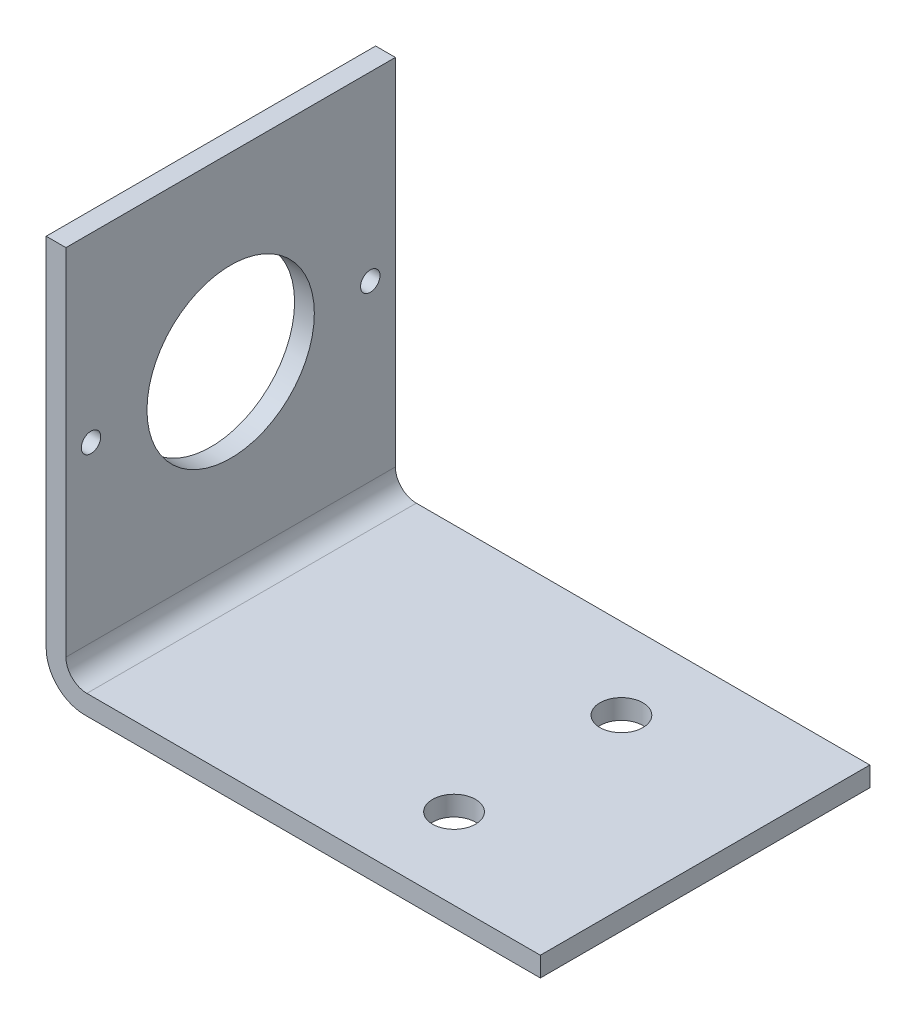
ISO-10303-21;
HEADER;
FILE_DESCRIPTION(('STEP AP214'),'2;1');
FILE_NAME('part.step','',(''),(''),'','','');
FILE_SCHEMA(('AUTOMOTIVE_DESIGN { 1 0 10303 214 1 1 1 1 }'));
ENDSEC;
DATA;
#1=APPLICATION_CONTEXT('core data for automotive mechanical design processes');
#2=APPLICATION_PROTOCOL_DEFINITION('international standard','automotive_design',2000,#1);
#3=PRODUCT_CONTEXT('',#1,'mechanical');
#4=PRODUCT('Part','Part','',(#3));
#5=PRODUCT_RELATED_PRODUCT_CATEGORY('part','',(#4));
#6=PRODUCT_DEFINITION_FORMATION('','',#4);
#7=PRODUCT_DEFINITION_CONTEXT('part definition',#1,'design');
#8=PRODUCT_DEFINITION('design','',#6,#7);
#9=PRODUCT_DEFINITION_SHAPE('','',#8);
#10=(LENGTH_UNIT() NAMED_UNIT(*) SI_UNIT(.MILLI.,.METRE.));
#11=(NAMED_UNIT(*) PLANE_ANGLE_UNIT() SI_UNIT($,.RADIAN.));
#12=(NAMED_UNIT(*) SI_UNIT($,.STERADIAN.) SOLID_ANGLE_UNIT());
#13=UNCERTAINTY_MEASURE_WITH_UNIT(LENGTH_MEASURE(1.E-05),#10,'distance_accuracy_value','');
#14=(GEOMETRIC_REPRESENTATION_CONTEXT(3) GLOBAL_UNCERTAINTY_ASSIGNED_CONTEXT((#13)) GLOBAL_UNIT_ASSIGNED_CONTEXT((#10,
#11,#12)) REPRESENTATION_CONTEXT('',''));
#15=CARTESIAN_POINT('',(0.,0.,0.));
#16=DIRECTION('',(0.,0.,1.));
#17=DIRECTION('',(1.,0.,0.));
#18=AXIS2_PLACEMENT_3D('',#15,#16,#17);
#19=CARTESIAN_POINT('',(0.,59.9948,50.));
#20=DIRECTION('',(0.,-1.,0.));
#21=DIRECTION('',(0.,0.,-1.));
#22=AXIS2_PLACEMENT_3D('',#19,#20,#21);
#23=PLANE('',#22);
#24=DIRECTION('',(-1.,0.,0.));
#25=VECTOR('',#24,1.);
#26=CARTESIAN_POINT('',(0.,59.9948,0.));
#27=LINE('',#26,#25);
#28=CARTESIAN_POINT('',(2.9972,59.9948,0.));
#29=VERTEX_POINT('',#28);
#30=CARTESIAN_POINT('',(0.,59.9948,0.));
#31=VERTEX_POINT('',#30);
#32=EDGE_CURVE('E130',#29,#31,#27,.T.);
#33=ORIENTED_EDGE('',*,*,#32,.T.);
#34=DIRECTION('',(0.,0.,-1.));
#35=VECTOR('',#34,1.);
#36=CARTESIAN_POINT('',(0.,59.9948,50.));
#37=LINE('',#36,#35);
#38=CARTESIAN_POINT('',(0.,59.9948,50.));
#39=VERTEX_POINT('',#38);
#40=EDGE_CURVE('E11',#39,#31,#37,.T.);
#41=ORIENTED_EDGE('',*,*,#40,.F.);
#42=DIRECTION('',(-1.,0.,0.));
#43=VECTOR('',#42,1.);
#44=CARTESIAN_POINT('',(0.,59.9948,50.));
#45=LINE('',#44,#43);
#46=CARTESIAN_POINT('',(2.9972,59.9948,50.));
#47=VERTEX_POINT('',#46);
#48=EDGE_CURVE('E145',#47,#39,#45,.T.);
#49=ORIENTED_EDGE('',*,*,#48,.F.);
#50=DIRECTION('',(0.,0.,-1.));
#51=VECTOR('',#50,1.);
#52=CARTESIAN_POINT('',(2.9972,59.9948,50.));
#53=LINE('',#52,#51);
#54=EDGE_CURVE('E126',#47,#29,#53,.T.);
#55=ORIENTED_EDGE('',*,*,#54,.T.);
#56=EDGE_LOOP('',(#33,#41,#49,#55));
#57=FACE_BOUND('',#56,.T.);
#58=ADVANCED_FACE('F32',(#57),#23,.F.);
#59=CARTESIAN_POINT('',(0.,5.84200000000004,50.));
#60=DIRECTION('',(1.,0.,0.));
#61=DIRECTION('',(0.,0.,-1.));
#62=AXIS2_PLACEMENT_3D('',#59,#60,#61);
#63=PLANE('',#62);
#64=CARTESIAN_POINT('',(0.,32.5,46.19));
#65=DIRECTION('',(-1.,0.,0.));
#66=DIRECTION('',(0.,0.,-1.));
#67=AXIS2_PLACEMENT_3D('',#64,#65,#66);
#68=CIRCLE('',#67,1.4732);
#69=CARTESIAN_POINT('',(0.,32.5,44.7168));
#70=VERTEX_POINT('',#69);
#71=EDGE_CURVE('E173',#70,#70,#68,.T.);
#72=ORIENTED_EDGE('',*,*,#71,.F.);
#73=EDGE_LOOP('',(#72));
#74=FACE_BOUND('',#73,.T.);
#75=CARTESIAN_POINT('',(0.,32.5,3.81));
#76=DIRECTION('',(-1.,0.,0.));
#77=DIRECTION('',(0.,0.,1.));
#78=AXIS2_PLACEMENT_3D('',#75,#76,#77);
#79=CIRCLE('',#78,1.4732);
#80=CARTESIAN_POINT('',(0.,32.5,5.2832));
#81=VERTEX_POINT('',#80);
#82=EDGE_CURVE('E163',#81,#81,#79,.T.);
#83=ORIENTED_EDGE('',*,*,#82,.F.);
#84=EDGE_LOOP('',(#83));
#85=FACE_BOUND('',#84,.T.);
#86=CARTESIAN_POINT('',(0.,32.5,25.));
#87=DIRECTION('',(-1.,0.,0.));
#88=DIRECTION('',(0.,0.,1.));
#89=AXIS2_PLACEMENT_3D('',#86,#87,#88);
#90=CIRCLE('',#89,12.7);
#91=CARTESIAN_POINT('',(0.,32.5,37.7));
#92=VERTEX_POINT('',#91);
#93=EDGE_CURVE('E160',#92,#92,#90,.T.);
#94=ORIENTED_EDGE('',*,*,#93,.F.);
#95=EDGE_LOOP('',(#94));
#96=FACE_BOUND('',#95,.T.);
#97=DIRECTION('',(0.,-1.,0.));
#98=VECTOR('',#97,1.);
#99=CARTESIAN_POINT('',(0.,5.84200000000004,0.));
#100=LINE('',#99,#98);
#101=CARTESIAN_POINT('',(0.,5.84200000000004,0.));
#102=VERTEX_POINT('',#101);
#103=EDGE_CURVE('E133',#31,#102,#100,.T.);
#104=ORIENTED_EDGE('',*,*,#103,.T.);
#105=DIRECTION('',(0.,0.,-1.));
#106=VECTOR('',#105,1.);
#107=CARTESIAN_POINT('',(0.,5.84200000000004,50.));
#108=LINE('',#107,#106);
#109=CARTESIAN_POINT('',(0.,5.84200000000004,50.));
#110=VERTEX_POINT('',#109);
#111=EDGE_CURVE('E41',#110,#102,#108,.T.);
#112=ORIENTED_EDGE('',*,*,#111,.F.);
#113=DIRECTION('',(0.,-1.,0.));
#114=VECTOR('',#113,1.);
#115=CARTESIAN_POINT('',(0.,5.84200000000004,50.));
#116=LINE('',#115,#114);
#117=EDGE_CURVE('E93',#39,#110,#116,.T.);
#118=ORIENTED_EDGE('',*,*,#117,.F.);
#119=ORIENTED_EDGE('',*,*,#40,.T.);
#120=EDGE_LOOP('',(#104,#112,#118,#119));
#121=FACE_BOUND('',#120,.T.);
#122=ADVANCED_FACE('F220',(#74,#85,#96,#121),#63,.F.);
#123=CARTESIAN_POINT('',(5.842,5.842,50.));
#124=DIRECTION('',(0.,0.,-1.));
#125=DIRECTION('',(-1.,0.,0.));
#126=AXIS2_PLACEMENT_3D('',#123,#124,#125);
#127=CYLINDRICAL_SURFACE('',#126,5.842);
#128=CARTESIAN_POINT('',(5.842,5.842,0.));
#129=DIRECTION('',(0.,0.,1.));
#130=DIRECTION('',(1.,0.,0.));
#131=AXIS2_PLACEMENT_3D('',#128,#129,#130);
#132=CIRCLE('',#131,5.842);
#133=CARTESIAN_POINT('',(5.84200000000004,0.,0.));
#134=VERTEX_POINT('',#133);
#135=EDGE_CURVE('E136',#102,#134,#132,.T.);
#136=ORIENTED_EDGE('',*,*,#135,.T.);
#137=DIRECTION('',(0.,0.,-1.));
#138=VECTOR('',#137,1.);
#139=CARTESIAN_POINT('',(5.84200000000004,0.,50.));
#140=LINE('',#139,#138);
#141=CARTESIAN_POINT('',(5.84200000000004,0.,50.));
#142=VERTEX_POINT('',#141);
#143=EDGE_CURVE('E152',#142,#134,#140,.T.);
#144=ORIENTED_EDGE('',*,*,#143,.F.);
#145=CARTESIAN_POINT('',(5.842,5.842,50.));
#146=DIRECTION('',(0.,0.,1.));
#147=DIRECTION('',(1.,0.,0.));
#148=AXIS2_PLACEMENT_3D('',#145,#146,#147);
#149=CIRCLE('',#148,5.842);
#150=EDGE_CURVE('E188',#110,#142,#149,.T.);
#151=ORIENTED_EDGE('',*,*,#150,.F.);
#152=ORIENTED_EDGE('',*,*,#111,.T.);
#153=EDGE_LOOP('',(#136,#144,#151,#152));
#154=FACE_BOUND('',#153,.T.);
#155=ADVANCED_FACE('F224',(#154),#127,.T.);
#156=CARTESIAN_POINT('',(5.84200000000004,0.,50.));
#157=DIRECTION('',(0.,1.,0.));
#158=DIRECTION('',(0.,0.,1.));
#159=AXIS2_PLACEMENT_3D('',#156,#157,#158);
#160=PLANE('',#159);
#161=CARTESIAN_POINT('',(49.6,0.,37.7));
#162=DIRECTION('',(0.,1.,0.));
#163=DIRECTION('',(0.,0.,1.));
#164=AXIS2_PLACEMENT_3D('',#161,#162,#163);
#165=CIRCLE('',#164,3.26389999999999);
#166=CARTESIAN_POINT('',(49.6,0.,40.9639));
#167=VERTEX_POINT('',#166);
#168=EDGE_CURVE('E176',#167,#167,#165,.T.);
#169=ORIENTED_EDGE('',*,*,#168,.T.);
#170=EDGE_LOOP('',(#169));
#171=FACE_BOUND('',#170,.T.);
#172=CARTESIAN_POINT('',(49.6,0.,12.3));
#173=DIRECTION('',(0.,1.,0.));
#174=DIRECTION('',(0.,0.,1.));
#175=AXIS2_PLACEMENT_3D('',#172,#173,#174);
#176=CIRCLE('',#175,3.26389999999999);
#177=CARTESIAN_POINT('',(49.6,0.,15.5639));
#178=VERTEX_POINT('',#177);
#179=EDGE_CURVE('E134',#178,#178,#176,.T.);
#180=ORIENTED_EDGE('',*,*,#179,.T.);
#181=EDGE_LOOP('',(#180));
#182=FACE_BOUND('',#181,.T.);
#183=DIRECTION('',(1.,0.,0.));
#184=VECTOR('',#183,1.);
#185=CARTESIAN_POINT('',(5.84200000000004,0.,0.));
#186=LINE('',#185,#184);
#187=CARTESIAN_POINT('',(75.,0.,0.));
#188=VERTEX_POINT('',#187);
#189=EDGE_CURVE('E138',#134,#188,#186,.T.);
#190=ORIENTED_EDGE('',*,*,#189,.T.);
#191=DIRECTION('',(0.,0.,-1.));
#192=VECTOR('',#191,1.);
#193=CARTESIAN_POINT('',(75.,0.,50.));
#194=LINE('',#193,#192);
#195=CARTESIAN_POINT('',(75.,0.,50.));
#196=VERTEX_POINT('',#195);
#197=EDGE_CURVE('E149',#196,#188,#194,.T.);
#198=ORIENTED_EDGE('',*,*,#197,.F.);
#199=DIRECTION('',(1.,0.,0.));
#200=VECTOR('',#199,1.);
#201=CARTESIAN_POINT('',(5.84200000000004,0.,50.));
#202=LINE('',#201,#200);
#203=EDGE_CURVE('E190',#142,#196,#202,.T.);
#204=ORIENTED_EDGE('',*,*,#203,.F.);
#205=ORIENTED_EDGE('',*,*,#143,.T.);
#206=EDGE_LOOP('',(#190,#198,#204,#205));
#207=FACE_BOUND('',#206,.T.);
#208=ADVANCED_FACE('F196',(#171,#182,#207),#160,.F.);
#209=CARTESIAN_POINT('',(75.,2.9972,50.));
#210=DIRECTION('',(-1.,0.,0.));
#211=DIRECTION('',(0.,0.,1.));
#212=AXIS2_PLACEMENT_3D('',#209,#210,#211);
#213=PLANE('',#212);
#214=DIRECTION('',(0.,1.,0.));
#215=VECTOR('',#214,1.);
#216=CARTESIAN_POINT('',(75.,2.9972,0.));
#217=LINE('',#216,#215);
#218=CARTESIAN_POINT('',(75.,2.9972,0.));
#219=VERTEX_POINT('',#218);
#220=EDGE_CURVE('E140',#188,#219,#217,.T.);
#221=ORIENTED_EDGE('',*,*,#220,.T.);
#222=DIRECTION('',(0.,0.,-1.));
#223=VECTOR('',#222,1.);
#224=CARTESIAN_POINT('',(75.,2.9972,50.));
#225=LINE('',#224,#223);
#226=CARTESIAN_POINT('',(75.,2.9972,50.));
#227=VERTEX_POINT('',#226);
#228=EDGE_CURVE('E121',#227,#219,#225,.T.);
#229=ORIENTED_EDGE('',*,*,#228,.F.);
#230=DIRECTION('',(0.,1.,0.));
#231=VECTOR('',#230,1.);
#232=CARTESIAN_POINT('',(75.,2.9972,50.));
#233=LINE('',#232,#231);
#234=EDGE_CURVE('E112',#196,#227,#233,.T.);
#235=ORIENTED_EDGE('',*,*,#234,.F.);
#236=ORIENTED_EDGE('',*,*,#197,.T.);
#237=EDGE_LOOP('',(#221,#229,#235,#236));
#238=FACE_BOUND('',#237,.T.);
#239=ADVANCED_FACE('F200',(#238),#213,.F.);
#240=CARTESIAN_POINT('',(6.1722,2.9972,50.));
#241=DIRECTION('',(0.,-1.,0.));
#242=DIRECTION('',(0.,0.,-1.));
#243=AXIS2_PLACEMENT_3D('',#240,#241,#242);
#244=PLANE('',#243);
#245=CARTESIAN_POINT('',(49.6,2.9972,37.7));
#246=DIRECTION('',(0.,1.,0.));
#247=DIRECTION('',(0.,0.,1.));
#248=AXIS2_PLACEMENT_3D('',#245,#246,#247);
#249=CIRCLE('',#248,3.26389999999999);
#250=CARTESIAN_POINT('',(49.6,2.9972,40.9639));
#251=VERTEX_POINT('',#250);
#252=EDGE_CURVE('E159',#251,#251,#249,.T.);
#253=ORIENTED_EDGE('',*,*,#252,.F.);
#254=EDGE_LOOP('',(#253));
#255=FACE_BOUND('',#254,.T.);
#256=CARTESIAN_POINT('',(49.6,2.9972,12.3));
#257=DIRECTION('',(0.,1.,0.));
#258=DIRECTION('',(0.,0.,1.));
#259=AXIS2_PLACEMENT_3D('',#256,#257,#258);
#260=CIRCLE('',#259,3.26389999999999);
#261=CARTESIAN_POINT('',(49.6,2.9972,15.5639));
#262=VERTEX_POINT('',#261);
#263=EDGE_CURVE('E179',#262,#262,#260,.T.);
#264=ORIENTED_EDGE('',*,*,#263,.F.);
#265=EDGE_LOOP('',(#264));
#266=FACE_BOUND('',#265,.T.);
#267=DIRECTION('',(-1.,0.,0.));
#268=VECTOR('',#267,1.);
#269=CARTESIAN_POINT('',(6.1722,2.9972,0.));
#270=LINE('',#269,#268);
#271=CARTESIAN_POINT('',(6.1722,2.9972,0.));
#272=VERTEX_POINT('',#271);
#273=EDGE_CURVE('E120',#219,#272,#270,.T.);
#274=ORIENTED_EDGE('',*,*,#273,.T.);
#275=DIRECTION('',(0.,0.,-1.));
#276=VECTOR('',#275,1.);
#277=CARTESIAN_POINT('',(6.1722,2.9972,50.));
#278=LINE('',#277,#276);
#279=CARTESIAN_POINT('',(6.1722,2.9972,50.));
#280=VERTEX_POINT('',#279);
#281=EDGE_CURVE('E117',#280,#272,#278,.T.);
#282=ORIENTED_EDGE('',*,*,#281,.F.);
#283=DIRECTION('',(-1.,0.,0.));
#284=VECTOR('',#283,1.);
#285=CARTESIAN_POINT('',(6.1722,2.9972,50.));
#286=LINE('',#285,#284);
#287=EDGE_CURVE('E106',#227,#280,#286,.T.);
#288=ORIENTED_EDGE('',*,*,#287,.F.);
#289=ORIENTED_EDGE('',*,*,#228,.T.);
#290=EDGE_LOOP('',(#274,#282,#288,#289));
#291=FACE_BOUND('',#290,.T.);
#292=ADVANCED_FACE('F118',(#255,#266,#291),#244,.F.);
#293=CARTESIAN_POINT('',(6.1722,6.1722,50.));
#294=DIRECTION('',(0.,0.,-1.));
#295=DIRECTION('',(-1.,0.,0.));
#296=AXIS2_PLACEMENT_3D('',#293,#294,#295);
#297=CYLINDRICAL_SURFACE('',#296,3.175);
#298=CARTESIAN_POINT('',(6.1722,6.1722,0.));
#299=DIRECTION('',(0.,0.,-1.));
#300=DIRECTION('',(-1.,0.,0.));
#301=AXIS2_PLACEMENT_3D('',#298,#299,#300);
#302=CIRCLE('',#301,3.175);
#303=CARTESIAN_POINT('',(2.9972,6.1722,0.));
#304=VERTEX_POINT('',#303);
#305=EDGE_CURVE('E79',#272,#304,#302,.T.);
#306=ORIENTED_EDGE('',*,*,#305,.T.);
#307=DIRECTION('',(0.,0.,-1.));
#308=VECTOR('',#307,1.);
#309=CARTESIAN_POINT('',(2.9972,6.1722,50.));
#310=LINE('',#309,#308);
#311=CARTESIAN_POINT('',(2.9972,6.1722,50.));
#312=VERTEX_POINT('',#311);
#313=EDGE_CURVE('E122',#312,#304,#310,.T.);
#314=ORIENTED_EDGE('',*,*,#313,.F.);
#315=CARTESIAN_POINT('',(6.1722,6.1722,50.));
#316=DIRECTION('',(0.,0.,-1.));
#317=DIRECTION('',(-1.,0.,0.));
#318=AXIS2_PLACEMENT_3D('',#315,#316,#317);
#319=CIRCLE('',#318,3.175);
#320=EDGE_CURVE('E110',#280,#312,#319,.T.);
#321=ORIENTED_EDGE('',*,*,#320,.F.);
#322=ORIENTED_EDGE('',*,*,#281,.T.);
#323=EDGE_LOOP('',(#306,#314,#321,#322));
#324=FACE_BOUND('',#323,.T.);
#325=ADVANCED_FACE('F124',(#324),#297,.F.);
#326=CARTESIAN_POINT('',(2.9972,6.1722,50.));
#327=DIRECTION('',(-1.,0.,0.));
#328=DIRECTION('',(0.,0.,1.));
#329=AXIS2_PLACEMENT_3D('',#326,#327,#328);
#330=PLANE('',#329);
#331=CARTESIAN_POINT('',(2.99720000000001,32.5,46.19));
#332=DIRECTION('',(-1.,0.,0.));
#333=DIRECTION('',(0.,0.,1.));
#334=AXIS2_PLACEMENT_3D('',#331,#332,#333);
#335=CIRCLE('',#334,1.4732);
#336=CARTESIAN_POINT('',(2.99720000000001,32.5,47.6632));
#337=VERTEX_POINT('',#336);
#338=EDGE_CURVE('E35',#337,#337,#335,.T.);
#339=ORIENTED_EDGE('',*,*,#338,.T.);
#340=EDGE_LOOP('',(#339));
#341=FACE_BOUND('',#340,.T.);
#342=CARTESIAN_POINT('',(2.99720000000001,32.5,3.81));
#343=DIRECTION('',(-1.,0.,0.));
#344=DIRECTION('',(0.,0.,1.));
#345=AXIS2_PLACEMENT_3D('',#342,#343,#344);
#346=CIRCLE('',#345,1.4732);
#347=CARTESIAN_POINT('',(2.99720000000001,32.5,5.2832));
#348=VERTEX_POINT('',#347);
#349=EDGE_CURVE('E161',#348,#348,#346,.T.);
#350=ORIENTED_EDGE('',*,*,#349,.T.);
#351=EDGE_LOOP('',(#350));
#352=FACE_BOUND('',#351,.T.);
#353=CARTESIAN_POINT('',(2.99720000000001,32.5,25.));
#354=DIRECTION('',(-1.,0.,0.));
#355=DIRECTION('',(0.,0.,1.));
#356=AXIS2_PLACEMENT_3D('',#353,#354,#355);
#357=CIRCLE('',#356,12.7);
#358=CARTESIAN_POINT('',(2.99720000000001,32.5,37.7));
#359=VERTEX_POINT('',#358);
#360=EDGE_CURVE('E157',#359,#359,#357,.T.);
#361=ORIENTED_EDGE('',*,*,#360,.T.);
#362=EDGE_LOOP('',(#361));
#363=FACE_BOUND('',#362,.T.);
#364=DIRECTION('',(0.,1.,0.));
#365=VECTOR('',#364,1.);
#366=CARTESIAN_POINT('',(2.9972,6.1722,0.));
#367=LINE('',#366,#365);
#368=EDGE_CURVE('E85',#304,#29,#367,.T.);
#369=ORIENTED_EDGE('',*,*,#368,.T.);
#370=ORIENTED_EDGE('',*,*,#54,.F.);
#371=DIRECTION('',(0.,1.,0.));
#372=VECTOR('',#371,1.);
#373=CARTESIAN_POINT('',(2.9972,6.1722,50.));
#374=LINE('',#373,#372);
#375=EDGE_CURVE('E50',#312,#47,#374,.T.);
#376=ORIENTED_EDGE('',*,*,#375,.F.);
#377=ORIENTED_EDGE('',*,*,#313,.T.);
#378=EDGE_LOOP('',(#369,#370,#376,#377));
#379=FACE_BOUND('',#378,.T.);
#380=ADVANCED_FACE('F208',(#341,#352,#363,#379),#330,.F.);
#381=CARTESIAN_POINT('',(6.1722,6.1722,50.));
#382=DIRECTION('',(0.,0.,-1.));
#383=DIRECTION('',(-1.,0.,0.));
#384=AXIS2_PLACEMENT_3D('',#381,#382,#383);
#385=PLANE('',#384);
#386=ORIENTED_EDGE('',*,*,#48,.T.);
#387=ORIENTED_EDGE('',*,*,#117,.T.);
#388=ORIENTED_EDGE('',*,*,#150,.T.);
#389=ORIENTED_EDGE('',*,*,#203,.T.);
#390=ORIENTED_EDGE('',*,*,#234,.T.);
#391=ORIENTED_EDGE('',*,*,#287,.T.);
#392=ORIENTED_EDGE('',*,*,#320,.T.);
#393=ORIENTED_EDGE('',*,*,#375,.T.);
#394=EDGE_LOOP('',(#386,#387,#388,#389,#390,#391,#392,#393));
#395=FACE_BOUND('',#394,.T.);
#396=ADVANCED_FACE('F108',(#395),#385,.F.);
#397=CARTESIAN_POINT('',(6.1722,6.1722,0.));
#398=DIRECTION('',(0.,0.,-1.));
#399=DIRECTION('',(-1.,0.,0.));
#400=AXIS2_PLACEMENT_3D('',#397,#398,#399);
#401=PLANE('',#400);
#402=ORIENTED_EDGE('',*,*,#32,.F.);
#403=ORIENTED_EDGE('',*,*,#368,.F.);
#404=ORIENTED_EDGE('',*,*,#305,.F.);
#405=ORIENTED_EDGE('',*,*,#273,.F.);
#406=ORIENTED_EDGE('',*,*,#220,.F.);
#407=ORIENTED_EDGE('',*,*,#189,.F.);
#408=ORIENTED_EDGE('',*,*,#135,.F.);
#409=ORIENTED_EDGE('',*,*,#103,.F.);
#410=EDGE_LOOP('',(#402,#403,#404,#405,#406,#407,#408,#409));
#411=FACE_BOUND('',#410,.T.);
#412=ADVANCED_FACE('F203',(#411),#401,.T.);
#413=CARTESIAN_POINT('',(49.6,0.,12.3));
#414=DIRECTION('',(0.,1.,0.));
#415=DIRECTION('',(0.,0.,1.));
#416=AXIS2_PLACEMENT_3D('',#413,#414,#415);
#417=CYLINDRICAL_SURFACE('',#416,3.26389999999999);
#418=CARTESIAN_POINT('',(49.6,0.,15.5639));
#419=CARTESIAN_POINT('',(49.6,0.0312208333333333,15.5639));
#420=CARTESIAN_POINT('',(49.6,0.0624416666666667,15.5639));
#421=CARTESIAN_POINT('',(49.6,0.124883333333333,15.5639));
#422=CARTESIAN_POINT('',(49.6,0.156104166666667,15.5639));
#423=CARTESIAN_POINT('',(49.6,0.218545833333333,15.5639));
#424=CARTESIAN_POINT('',(49.6,0.249766666666667,15.5639));
#425=CARTESIAN_POINT('',(49.6,0.312208333333333,15.5639));
#426=CARTESIAN_POINT('',(49.6,0.343429166666667,15.5639));
#427=CARTESIAN_POINT('',(49.6,0.405870833333333,15.5639));
#428=CARTESIAN_POINT('',(49.6,0.437091666666667,15.5639));
#429=CARTESIAN_POINT('',(49.6,0.499533333333333,15.5639));
#430=CARTESIAN_POINT('',(49.6,0.530754166666667,15.5639));
#431=CARTESIAN_POINT('',(49.6,0.593195833333333,15.5639));
#432=CARTESIAN_POINT('',(49.6,0.624416666666667,15.5639));
#433=CARTESIAN_POINT('',(49.6,0.686858333333333,15.5639));
#434=CARTESIAN_POINT('',(49.6,0.718079166666667,15.5639));
#435=CARTESIAN_POINT('',(49.6,0.780520833333333,15.5639));
#436=CARTESIAN_POINT('',(49.6,0.811741666666667,15.5639));
#437=CARTESIAN_POINT('',(49.6,0.874183333333333,15.5639));
#438=CARTESIAN_POINT('',(49.6,0.905404166666667,15.5639));
#439=CARTESIAN_POINT('',(49.6,0.967845833333333,15.5639));
#440=CARTESIAN_POINT('',(49.6,0.999066666666667,15.5639));
#441=CARTESIAN_POINT('',(49.6,1.06150833333333,15.5639));
#442=CARTESIAN_POINT('',(49.6,1.09272916666667,15.5639));
#443=CARTESIAN_POINT('',(49.6,1.15517083333333,15.5639));
#444=CARTESIAN_POINT('',(49.6,1.18639166666667,15.5639));
#445=CARTESIAN_POINT('',(49.6,1.24883333333333,15.5639));
#446=CARTESIAN_POINT('',(49.6,1.28005416666667,15.5639));
#447=CARTESIAN_POINT('',(49.6,1.34249583333333,15.5639));
#448=CARTESIAN_POINT('',(49.6,1.37371666666667,15.5639));
#449=CARTESIAN_POINT('',(49.6,1.43615833333333,15.5639));
#450=CARTESIAN_POINT('',(49.6,1.46737916666667,15.5639));
#451=CARTESIAN_POINT('',(49.6,1.52982083333333,15.5639));
#452=CARTESIAN_POINT('',(49.6,1.56104166666667,15.5639));
#453=CARTESIAN_POINT('',(49.6,1.62348333333333,15.5639));
#454=CARTESIAN_POINT('',(49.6,1.65470416666667,15.5639));
#455=CARTESIAN_POINT('',(49.6,1.71714583333333,15.5639));
#456=CARTESIAN_POINT('',(49.6,1.74836666666667,15.5639));
#457=CARTESIAN_POINT('',(49.6,1.81080833333333,15.5639));
#458=CARTESIAN_POINT('',(49.6,1.84202916666667,15.5639));
#459=CARTESIAN_POINT('',(49.6,1.90447083333333,15.5639));
#460=CARTESIAN_POINT('',(49.6,1.93569166666667,15.5639));
#461=CARTESIAN_POINT('',(49.6,1.99813333333333,15.5639));
#462=CARTESIAN_POINT('',(49.6,2.02935416666667,15.5639));
#463=CARTESIAN_POINT('',(49.6,2.09179583333333,15.5639));
#464=CARTESIAN_POINT('',(49.6,2.12301666666667,15.5639));
#465=CARTESIAN_POINT('',(49.6,2.18545833333333,15.5639));
#466=CARTESIAN_POINT('',(49.6,2.21667916666667,15.5639));
#467=CARTESIAN_POINT('',(49.6,2.27912083333333,15.5639));
#468=CARTESIAN_POINT('',(49.6,2.31034166666667,15.5639));
#469=CARTESIAN_POINT('',(49.6,2.37278333333333,15.5639));
#470=CARTESIAN_POINT('',(49.6,2.40400416666667,15.5639));
#471=CARTESIAN_POINT('',(49.6,2.46644583333333,15.5639));
#472=CARTESIAN_POINT('',(49.6,2.49766666666667,15.5639));
#473=CARTESIAN_POINT('',(49.6,2.56010833333333,15.5639));
#474=CARTESIAN_POINT('',(49.6,2.59132916666667,15.5639));
#475=CARTESIAN_POINT('',(49.6,2.65377083333333,15.5639));
#476=CARTESIAN_POINT('',(49.6,2.68499166666667,15.5639));
#477=CARTESIAN_POINT('',(49.6,2.74743333333333,15.5639));
#478=CARTESIAN_POINT('',(49.6,2.77865416666667,15.5639));
#479=CARTESIAN_POINT('',(49.6,2.84109583333333,15.5639));
#480=CARTESIAN_POINT('',(49.6,2.87231666666667,15.5639));
#481=CARTESIAN_POINT('',(49.6,2.93475833333333,15.5639));
#482=CARTESIAN_POINT('',(49.6,2.96597916666667,15.5639));
#483=CARTESIAN_POINT('',(49.6,2.9972,15.5639));
#484=B_SPLINE_CURVE_WITH_KNOTS('',3,(#418,#419,#420,#421,#422,#423,#424,#425,#426,#427,#428,
#429,#430,#431,#432,#433,#434,#435,#436,#437,#438,#439,#440,#441,#442,#443,#444,#445,#446,#447,
#448,#449,#450,#451,#452,#453,#454,#455,#456,#457,#458,#459,#460,#461,#462,#463,#464,#465,#466,
#467,#468,#469,#470,#471,#472,#473,#474,#475,#476,#477,#478,#479,#480,#481,#482,#483),
.UNSPECIFIED.,.F.,.F.,(4,2,2,2,2,2,2,2,2,2,2,2,2,2,2,2,2,2,2,2,2,2,2,2,2,2,2,2,2,2,2,2,4),(0.,
0.0936625,0.187325,0.2809875,0.37465,0.4683125,0.561975,0.6556375,0.7493,0.8429625,0.936625,
1.0302875,1.12395,1.2176125,1.311275,1.4049375,1.4986,1.5922625,1.685925,1.7795875,1.87325,
1.9669125,2.060575,2.1542375,2.2479,2.3415625,2.435225,2.5288875,2.62255,2.7162125,2.809875,
2.9035375,2.9972),.UNSPECIFIED.);
#485=EDGE_CURVE('BSEAM247',#178,#262,#484,.T.);
#486=ORIENTED_EDGE('',*,*,#179,.F.);
#487=ORIENTED_EDGE('',*,*,#263,.T.);
#488=ORIENTED_EDGE('',*,*,#485,.T.);
#489=ORIENTED_EDGE('',*,*,#485,.F.);
#490=EDGE_LOOP('',(#486,#488,#487,#489));
#491=FACE_BOUND('',#490,.T.);
#492=ADVANCED_FACE('F247',(#491),#417,.F.);
#493=CARTESIAN_POINT('',(49.6,0.,37.7));
#494=DIRECTION('',(0.,1.,0.));
#495=DIRECTION('',(0.,0.,1.));
#496=AXIS2_PLACEMENT_3D('',#493,#494,#495);
#497=CYLINDRICAL_SURFACE('',#496,3.26389999999999);
#498=CARTESIAN_POINT('',(49.6,0.,40.9639));
#499=CARTESIAN_POINT('',(49.6,0.0312208333333333,40.9639));
#500=CARTESIAN_POINT('',(49.6,0.0624416666666667,40.9639));
#501=CARTESIAN_POINT('',(49.6,0.124883333333333,40.9639));
#502=CARTESIAN_POINT('',(49.6,0.156104166666667,40.9639));
#503=CARTESIAN_POINT('',(49.6,0.218545833333333,40.9639));
#504=CARTESIAN_POINT('',(49.6,0.249766666666667,40.9639));
#505=CARTESIAN_POINT('',(49.6,0.312208333333333,40.9639));
#506=CARTESIAN_POINT('',(49.6,0.343429166666667,40.9639));
#507=CARTESIAN_POINT('',(49.6,0.405870833333333,40.9639));
#508=CARTESIAN_POINT('',(49.6,0.437091666666667,40.9639));
#509=CARTESIAN_POINT('',(49.6,0.499533333333333,40.9639));
#510=CARTESIAN_POINT('',(49.6,0.530754166666667,40.9639));
#511=CARTESIAN_POINT('',(49.6,0.593195833333333,40.9639));
#512=CARTESIAN_POINT('',(49.6,0.624416666666667,40.9639));
#513=CARTESIAN_POINT('',(49.6,0.686858333333333,40.9639));
#514=CARTESIAN_POINT('',(49.6,0.718079166666667,40.9639));
#515=CARTESIAN_POINT('',(49.6,0.780520833333333,40.9639));
#516=CARTESIAN_POINT('',(49.6,0.811741666666667,40.9639));
#517=CARTESIAN_POINT('',(49.6,0.874183333333333,40.9639));
#518=CARTESIAN_POINT('',(49.6,0.905404166666667,40.9639));
#519=CARTESIAN_POINT('',(49.6,0.967845833333333,40.9639));
#520=CARTESIAN_POINT('',(49.6,0.999066666666667,40.9639));
#521=CARTESIAN_POINT('',(49.6,1.06150833333333,40.9639));
#522=CARTESIAN_POINT('',(49.6,1.09272916666667,40.9639));
#523=CARTESIAN_POINT('',(49.6,1.15517083333333,40.9639));
#524=CARTESIAN_POINT('',(49.6,1.18639166666667,40.9639));
#525=CARTESIAN_POINT('',(49.6,1.24883333333333,40.9639));
#526=CARTESIAN_POINT('',(49.6,1.28005416666667,40.9639));
#527=CARTESIAN_POINT('',(49.6,1.34249583333333,40.9639));
#528=CARTESIAN_POINT('',(49.6,1.37371666666667,40.9639));
#529=CARTESIAN_POINT('',(49.6,1.43615833333333,40.9639));
#530=CARTESIAN_POINT('',(49.6,1.46737916666667,40.9639));
#531=CARTESIAN_POINT('',(49.6,1.52982083333333,40.9639));
#532=CARTESIAN_POINT('',(49.6,1.56104166666667,40.9639));
#533=CARTESIAN_POINT('',(49.6,1.62348333333333,40.9639));
#534=CARTESIAN_POINT('',(49.6,1.65470416666667,40.9639));
#535=CARTESIAN_POINT('',(49.6,1.71714583333333,40.9639));
#536=CARTESIAN_POINT('',(49.6,1.74836666666667,40.9639));
#537=CARTESIAN_POINT('',(49.6,1.81080833333333,40.9639));
#538=CARTESIAN_POINT('',(49.6,1.84202916666667,40.9639));
#539=CARTESIAN_POINT('',(49.6,1.90447083333333,40.9639));
#540=CARTESIAN_POINT('',(49.6,1.93569166666667,40.9639));
#541=CARTESIAN_POINT('',(49.6,1.99813333333333,40.9639));
#542=CARTESIAN_POINT('',(49.6,2.02935416666667,40.9639));
#543=CARTESIAN_POINT('',(49.6,2.09179583333333,40.9639));
#544=CARTESIAN_POINT('',(49.6,2.12301666666667,40.9639));
#545=CARTESIAN_POINT('',(49.6,2.18545833333333,40.9639));
#546=CARTESIAN_POINT('',(49.6,2.21667916666667,40.9639));
#547=CARTESIAN_POINT('',(49.6,2.27912083333333,40.9639));
#548=CARTESIAN_POINT('',(49.6,2.31034166666667,40.9639));
#549=CARTESIAN_POINT('',(49.6,2.37278333333333,40.9639));
#550=CARTESIAN_POINT('',(49.6,2.40400416666667,40.9639));
#551=CARTESIAN_POINT('',(49.6,2.46644583333333,40.9639));
#552=CARTESIAN_POINT('',(49.6,2.49766666666667,40.9639));
#553=CARTESIAN_POINT('',(49.6,2.56010833333333,40.9639));
#554=CARTESIAN_POINT('',(49.6,2.59132916666667,40.9639));
#555=CARTESIAN_POINT('',(49.6,2.65377083333333,40.9639));
#556=CARTESIAN_POINT('',(49.6,2.68499166666667,40.9639));
#557=CARTESIAN_POINT('',(49.6,2.74743333333333,40.9639));
#558=CARTESIAN_POINT('',(49.6,2.77865416666667,40.9639));
#559=CARTESIAN_POINT('',(49.6,2.84109583333333,40.9639));
#560=CARTESIAN_POINT('',(49.6,2.87231666666667,40.9639));
#561=CARTESIAN_POINT('',(49.6,2.93475833333333,40.9639));
#562=CARTESIAN_POINT('',(49.6,2.96597916666667,40.9639));
#563=CARTESIAN_POINT('',(49.6,2.9972,40.9639));
#564=B_SPLINE_CURVE_WITH_KNOTS('',3,(#498,#499,#500,#501,#502,#503,#504,#505,#506,#507,#508,
#509,#510,#511,#512,#513,#514,#515,#516,#517,#518,#519,#520,#521,#522,#523,#524,#525,#526,#527,
#528,#529,#530,#531,#532,#533,#534,#535,#536,#537,#538,#539,#540,#541,#542,#543,#544,#545,#546,
#547,#548,#549,#550,#551,#552,#553,#554,#555,#556,#557,#558,#559,#560,#561,#562,#563),
.UNSPECIFIED.,.F.,.F.,(4,2,2,2,2,2,2,2,2,2,2,2,2,2,2,2,2,2,2,2,2,2,2,2,2,2,2,2,2,2,2,2,4),(0.,
0.0936625,0.187325,0.2809875,0.37465,0.4683125,0.561975,0.6556375,0.7493,0.8429625,0.936625,
1.0302875,1.12395,1.2176125,1.311275,1.4049375,1.4986,1.5922625,1.685925,1.7795875,1.87325,
1.9669125,2.060575,2.1542375,2.2479,2.3415625,2.435225,2.5288875,2.62255,2.7162125,2.809875,
2.9035375,2.9972),.UNSPECIFIED.);
#565=EDGE_CURVE('BSEAM249',#167,#251,#564,.T.);
#566=ORIENTED_EDGE('',*,*,#168,.F.);
#567=ORIENTED_EDGE('',*,*,#252,.T.);
#568=ORIENTED_EDGE('',*,*,#565,.T.);
#569=ORIENTED_EDGE('',*,*,#565,.F.);
#570=EDGE_LOOP('',(#566,#568,#567,#569));
#571=FACE_BOUND('',#570,.T.);
#572=ADVANCED_FACE('F249',(#571),#497,.F.);
#573=CARTESIAN_POINT('',(75.,32.5,25.));
#574=DIRECTION('',(-1.,0.,0.));
#575=DIRECTION('',(0.,0.,1.));
#576=AXIS2_PLACEMENT_3D('',#573,#574,#575);
#577=CYLINDRICAL_SURFACE('',#576,12.7);
#578=ORIENTED_EDGE('',*,*,#93,.T.);
#579=EDGE_LOOP('',(#578));
#580=FACE_BOUND('',#579,.T.);
#581=ORIENTED_EDGE('',*,*,#360,.F.);
#582=EDGE_LOOP('',(#581));
#583=FACE_BOUND('',#582,.T.);
#584=ADVANCED_FACE('F256',(#580,#583),#577,.F.);
#585=CARTESIAN_POINT('',(75.,32.5,3.81));
#586=DIRECTION('',(-1.,0.,0.));
#587=DIRECTION('',(0.,0.,1.));
#588=AXIS2_PLACEMENT_3D('',#585,#586,#587);
#589=CYLINDRICAL_SURFACE('',#588,1.4732);
#590=ORIENTED_EDGE('',*,*,#82,.T.);
#591=EDGE_LOOP('',(#590));
#592=FACE_BOUND('',#591,.T.);
#593=ORIENTED_EDGE('',*,*,#349,.F.);
#594=EDGE_LOOP('',(#593));
#595=FACE_BOUND('',#594,.T.);
#596=ADVANCED_FACE('F263',(#592,#595),#589,.F.);
#597=CARTESIAN_POINT('',(75.,32.5,46.19));
#598=DIRECTION('',(-1.,0.,0.));
#599=DIRECTION('',(0.,0.,1.));
#600=AXIS2_PLACEMENT_3D('',#597,#598,#599);
#601=CYLINDRICAL_SURFACE('',#600,1.4732);
#602=ORIENTED_EDGE('',*,*,#71,.T.);
#603=EDGE_LOOP('',(#602));
#604=FACE_BOUND('',#603,.T.);
#605=ORIENTED_EDGE('',*,*,#338,.F.);
#606=EDGE_LOOP('',(#605));
#607=FACE_BOUND('',#606,.T.);
#608=ADVANCED_FACE('F267',(#604,#607),#601,.F.);
#609=CLOSED_SHELL('',(#58,#122,#155,#208,#239,#292,#325,#380,#396,#412,#492,#572,#584,#596,#608));
#610=MANIFOLD_SOLID_BREP('B2',#609);
#611=ADVANCED_BREP_SHAPE_REPRESENTATION('',(#18,#610),#14);
#612=SHAPE_DEFINITION_REPRESENTATION(#9,#611);
ENDSEC;
END-ISO-10303-21;
